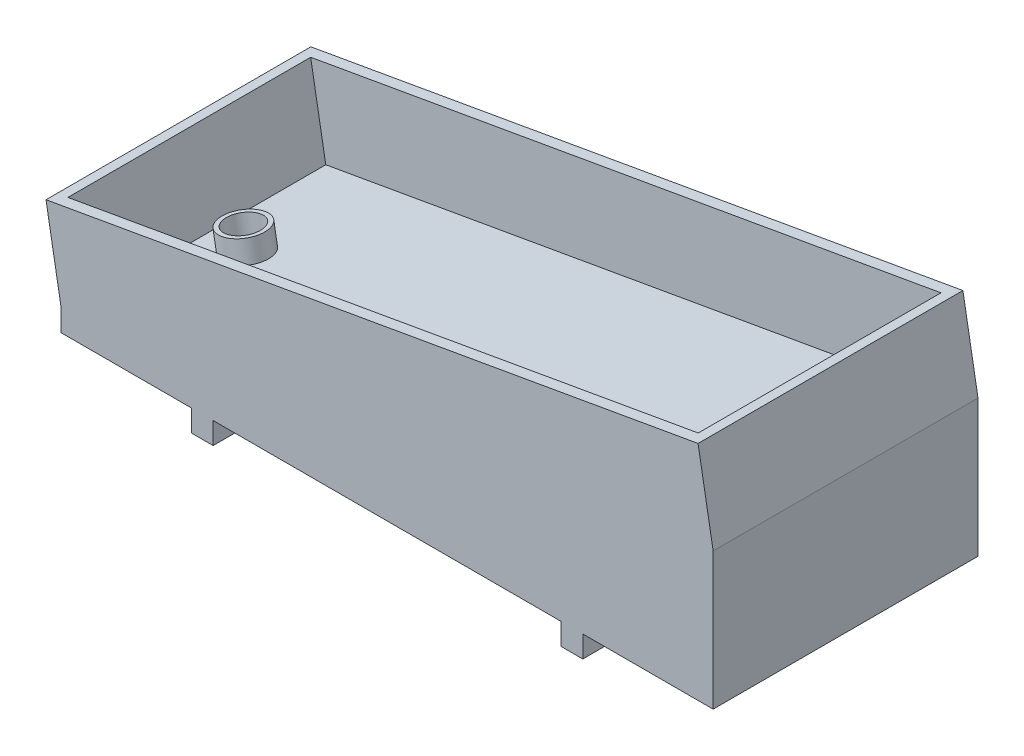
ISO-10303-21;
HEADER;
FILE_DESCRIPTION(('STEP AP214'),'2;1');
FILE_NAME('part.step','',(''),(''),'','','');
FILE_SCHEMA(('AUTOMOTIVE_DESIGN { 1 0 10303 214 1 1 1 1 }'));
ENDSEC;
DATA;
#1=APPLICATION_CONTEXT('core data for automotive mechanical design processes');
#2=APPLICATION_PROTOCOL_DEFINITION('international standard','automotive_design',2000,#1);
#3=PRODUCT_CONTEXT('',#1,'mechanical');
#4=PRODUCT('Part','Part','',(#3));
#5=PRODUCT_RELATED_PRODUCT_CATEGORY('part','',(#4));
#6=PRODUCT_DEFINITION_FORMATION('','',#4);
#7=PRODUCT_DEFINITION_CONTEXT('part definition',#1,'design');
#8=PRODUCT_DEFINITION('design','',#6,#7);
#9=PRODUCT_DEFINITION_SHAPE('','',#8);
#10=(LENGTH_UNIT() NAMED_UNIT(*) SI_UNIT(.MILLI.,.METRE.));
#11=(NAMED_UNIT(*) PLANE_ANGLE_UNIT() SI_UNIT($,.RADIAN.));
#12=(NAMED_UNIT(*) SI_UNIT($,.STERADIAN.) SOLID_ANGLE_UNIT());
#13=UNCERTAINTY_MEASURE_WITH_UNIT(LENGTH_MEASURE(1.E-05),#10,'distance_accuracy_value','');
#14=(GEOMETRIC_REPRESENTATION_CONTEXT(3) GLOBAL_UNCERTAINTY_ASSIGNED_CONTEXT((#13)) GLOBAL_UNIT_ASSIGNED_CONTEXT((#10,
#11,#12)) REPRESENTATION_CONTEXT('',''));
#15=CARTESIAN_POINT('',(0.,0.,0.));
#16=DIRECTION('',(0.,0.,1.));
#17=DIRECTION('',(1.,0.,0.));
#18=AXIS2_PLACEMENT_3D('',#15,#16,#17);
#19=CARTESIAN_POINT('',(0.,-50.8,609.6));
#20=DIRECTION('',(0.,1.,0.));
#21=DIRECTION('',(0.,0.,1.));
#22=AXIS2_PLACEMENT_3D('',#19,#20,#21);
#23=PLANE('',#22);
#24=DIRECTION('',(0.,0.,1.));
#25=VECTOR('',#24,1.);
#26=CARTESIAN_POINT('',(1200.8470155906,-50.8,-8.74808402730376E-13));
#27=LINE('',#26,#25);
#28=CARTESIAN_POINT('',(1200.8470155906,-50.8,0.));
#29=VERTEX_POINT('',#28);
#30=CARTESIAN_POINT('',(1200.8470155906,-50.8,609.6));
#31=VERTEX_POINT('',#30);
#32=EDGE_CURVE('E340',#29,#31,#27,.T.);
#33=ORIENTED_EDGE('',*,*,#32,.F.);
#34=DIRECTION('',(1.,0.,0.));
#35=VECTOR('',#34,1.);
#36=CARTESIAN_POINT('',(0.,-50.8,0.));
#37=LINE('',#36,#35);
#38=CARTESIAN_POINT('',(1500.8470155906,-50.8,0.));
#39=VERTEX_POINT('',#38);
#40=EDGE_CURVE('E192',#29,#39,#37,.T.);
#41=ORIENTED_EDGE('',*,*,#40,.T.);
#42=DIRECTION('',(0.,0.,-1.));
#43=VECTOR('',#42,1.);
#44=CARTESIAN_POINT('',(1500.8470155906,-50.8,609.6));
#45=LINE('',#44,#43);
#46=CARTESIAN_POINT('',(1500.8470155906,-50.8,609.6));
#47=VERTEX_POINT('',#46);
#48=EDGE_CURVE('E302',#47,#39,#45,.T.);
#49=ORIENTED_EDGE('',*,*,#48,.F.);
#50=DIRECTION('',(1.,0.,0.));
#51=VECTOR('',#50,1.);
#52=CARTESIAN_POINT('',(0.,-50.8,609.6));
#53=LINE('',#52,#51);
#54=EDGE_CURVE('E57',#31,#47,#53,.T.);
#55=ORIENTED_EDGE('',*,*,#54,.F.);
#56=EDGE_LOOP('',(#33,#41,#49,#55));
#57=FACE_BOUND('',#56,.T.);
#58=ADVANCED_FACE('F42',(#57),#23,.F.);
#59=DIRECTION('',(0.,0.,-1.));
#60=VECTOR('',#59,1.);
#61=CARTESIAN_POINT('',(1150.8470155906,-50.8,-4.19191881407426E-13));
#62=LINE('',#61,#60);
#63=CARTESIAN_POINT('',(1150.8470155906,-50.8,609.6));
#64=VERTEX_POINT('',#63);
#65=CARTESIAN_POINT('',(1150.8470155906,-50.8,0.));
#66=VERTEX_POINT('',#65);
#67=EDGE_CURVE('E65',#64,#66,#62,.T.);
#68=ORIENTED_EDGE('',*,*,#67,.F.);
#69=CARTESIAN_POINT('',(350.,-50.8,609.6));
#70=VERTEX_POINT('',#69);
#71=EDGE_CURVE('E289',#70,#64,#53,.T.);
#72=ORIENTED_EDGE('',*,*,#71,.F.);
#73=DIRECTION('',(0.,0.,-1.));
#74=VECTOR('',#73,1.);
#75=CARTESIAN_POINT('',(350.,-50.8,0.));
#76=LINE('',#75,#74);
#77=CARTESIAN_POINT('',(350.,-50.8,0.));
#78=VERTEX_POINT('',#77);
#79=EDGE_CURVE('E196',#70,#78,#76,.T.);
#80=ORIENTED_EDGE('',*,*,#79,.T.);
#81=EDGE_CURVE('E297',#78,#66,#37,.T.);
#82=ORIENTED_EDGE('',*,*,#81,.T.);
#83=EDGE_LOOP('',(#68,#72,#80,#82));
#84=FACE_BOUND('',#83,.T.);
#85=ADVANCED_FACE('F342',(#84),#23,.F.);
#86=CARTESIAN_POINT('',(136.291907750462,-50.8,304.8));
#87=DIRECTION('',(0.,1.,0.));
#88=DIRECTION('',(-1.,0.,0.));
#89=AXIS2_PLACEMENT_3D('',#86,#87,#88);
#90=ELLIPSE('',#89,40.6170644754298,40.);
#91=CARTESIAN_POINT('',(95.6748432750326,-50.8,304.8));
#92=VERTEX_POINT('',#91);
#93=EDGE_CURVE('E225',#92,#92,#90,.T.);
#94=ORIENTED_EDGE('',*,*,#93,.T.);
#95=EDGE_LOOP('',(#94));
#96=FACE_BOUND('',#95,.T.);
#97=CARTESIAN_POINT('',(0.,-50.8,0.));
#98=VERTEX_POINT('',#97);
#99=CARTESIAN_POINT('',(300.,-50.8,0.));
#100=VERTEX_POINT('',#99);
#101=EDGE_CURVE('E294',#98,#100,#37,.T.);
#102=ORIENTED_EDGE('',*,*,#101,.T.);
#103=DIRECTION('',(0.,0.,1.));
#104=VECTOR('',#103,1.);
#105=CARTESIAN_POINT('',(300.,-50.8,0.));
#106=LINE('',#105,#104);
#107=CARTESIAN_POINT('',(300.,-50.8,609.6));
#108=VERTEX_POINT('',#107);
#109=EDGE_CURVE('E193',#100,#108,#106,.T.);
#110=ORIENTED_EDGE('',*,*,#109,.T.);
#111=CARTESIAN_POINT('',(0.,-50.8,609.6));
#112=VERTEX_POINT('',#111);
#113=EDGE_CURVE('E285',#112,#108,#53,.T.);
#114=ORIENTED_EDGE('',*,*,#113,.F.);
#115=DIRECTION('',(0.,0.,-1.));
#116=VECTOR('',#115,1.);
#117=CARTESIAN_POINT('',(0.,-50.8,609.6));
#118=LINE('',#117,#116);
#119=EDGE_CURVE('E50',#112,#98,#118,.T.);
#120=ORIENTED_EDGE('',*,*,#119,.T.);
#121=EDGE_LOOP('',(#102,#110,#114,#120));
#122=FACE_BOUND('',#121,.T.);
#123=ADVANCED_FACE('F309',(#96,#122),#23,.F.);
#124=CARTESIAN_POINT('',(0.,0.,609.6));
#125=DIRECTION('',(1.,0.,0.));
#126=DIRECTION('',(0.,1.,0.));
#127=AXIS2_PLACEMENT_3D('',#124,#125,#126);
#128=PLANE('',#127);
#129=DIRECTION('',(0.,-1.,0.));
#130=VECTOR('',#129,1.);
#131=CARTESIAN_POINT('',(0.,0.,0.));
#132=LINE('',#131,#130);
#133=CARTESIAN_POINT('',(0.,0.,2.22044604925031E-13));
#134=VERTEX_POINT('',#133);
#135=EDGE_CURVE('E273',#134,#98,#132,.T.);
#136=ORIENTED_EDGE('',*,*,#135,.T.);
#137=ORIENTED_EDGE('',*,*,#119,.F.);
#138=DIRECTION('',(0.,-1.,0.));
#139=VECTOR('',#138,1.);
#140=CARTESIAN_POINT('',(0.,0.,609.6));
#141=LINE('',#140,#139);
#142=CARTESIAN_POINT('',(0.,0.,609.6));
#143=VERTEX_POINT('',#142);
#144=EDGE_CURVE('E282',#143,#112,#141,.T.);
#145=ORIENTED_EDGE('',*,*,#144,.F.);
#146=DIRECTION('',(0.,0.,-1.));
#147=VECTOR('',#146,1.);
#148=CARTESIAN_POINT('',(0.,0.,609.6));
#149=LINE('',#148,#147);
#150=EDGE_CURVE('E11',#143,#134,#149,.T.);
#151=ORIENTED_EDGE('',*,*,#150,.T.);
#152=EDGE_LOOP('',(#136,#137,#145,#151));
#153=FACE_BOUND('',#152,.T.);
#154=ADVANCED_FACE('F325',(#153),#128,.F.);
#155=CARTESIAN_POINT('',(1500.8470155906,0.,609.6));
#156=DIRECTION('',(-1.,0.,0.));
#157=DIRECTION('',(0.,0.,1.));
#158=AXIS2_PLACEMENT_3D('',#155,#156,#157);
#159=PLANE('',#158);
#160=DIRECTION('',(0.,1.,0.));
#161=VECTOR('',#160,1.);
#162=CARTESIAN_POINT('',(1500.8470155906,0.,0.));
#163=LINE('',#162,#161);
#164=CARTESIAN_POINT('',(1500.8470155906,264.639822764403,0.));
#165=VERTEX_POINT('',#164);
#166=EDGE_CURVE('E284',#39,#165,#163,.T.);
#167=ORIENTED_EDGE('',*,*,#166,.T.);
#168=DIRECTION('',(0.,0.,-1.));
#169=VECTOR('',#168,1.);
#170=CARTESIAN_POINT('',(1500.8470155906,264.639822764403,609.6));
#171=LINE('',#170,#169);
#172=CARTESIAN_POINT('',(1500.8470155906,264.639822764403,609.6));
#173=VERTEX_POINT('',#172);
#174=EDGE_CURVE('E292',#173,#165,#171,.T.);
#175=ORIENTED_EDGE('',*,*,#174,.F.);
#176=DIRECTION('',(0.,1.,0.));
#177=VECTOR('',#176,1.);
#178=CARTESIAN_POINT('',(1500.8470155906,0.,609.6));
#179=LINE('',#178,#177);
#180=EDGE_CURVE('E288',#47,#173,#179,.T.);
#181=ORIENTED_EDGE('',*,*,#180,.F.);
#182=ORIENTED_EDGE('',*,*,#48,.T.);
#183=EDGE_LOOP('',(#167,#175,#181,#182));
#184=FACE_BOUND('',#183,.T.);
#185=ADVANCED_FACE('F339',(#184),#159,.F.);
#186=CARTESIAN_POINT('',(0.,0.,609.6));
#187=DIRECTION('',(0.,0.,1.));
#188=DIRECTION('',(1.,0.,0.));
#189=AXIS2_PLACEMENT_3D('',#186,#187,#188);
#190=PLANE('',#189);
#191=ORIENTED_EDGE('',*,*,#180,.T.);
#192=DIRECTION('',(0.173648177666931,-0.984807753012208,0.));
#193=VECTOR('',#192,1.);
#194=CARTESIAN_POINT('',(1466.11738005722,461.601373366845,609.6));
#195=LINE('',#194,#193);
#196=CARTESIAN_POINT('',(1466.11738005722,461.601373366845,609.6));
#197=VERTEX_POINT('',#196);
#198=EDGE_CURVE('E265',#197,#173,#195,.T.);
#199=ORIENTED_EDGE('',*,*,#198,.F.);
#200=DIRECTION('',(0.984807753012208,0.173648177666931,0.));
#201=VECTOR('',#200,1.);
#202=CARTESIAN_POINT('',(-34.7296355333863,196.961550602442,609.6));
#203=LINE('',#202,#201);
#204=CARTESIAN_POINT('',(-34.7296355333863,196.961550602441,609.6));
#205=VERTEX_POINT('',#204);
#206=EDGE_CURVE('E250',#205,#197,#203,.T.);
#207=ORIENTED_EDGE('',*,*,#206,.F.);
#208=DIRECTION('',(0.173648177666931,-0.984807753012208,0.));
#209=VECTOR('',#208,1.);
#210=CARTESIAN_POINT('',(-34.7296355333863,196.961550602441,609.6));
#211=LINE('',#210,#209);
#212=EDGE_CURVE('E268',#205,#143,#211,.T.);
#213=ORIENTED_EDGE('',*,*,#212,.T.);
#214=ORIENTED_EDGE('',*,*,#144,.T.);
#215=ORIENTED_EDGE('',*,*,#113,.T.);
#216=DIRECTION('',(0.,1.,0.));
#217=VECTOR('',#216,1.);
#218=CARTESIAN_POINT('',(300.,-100.8,609.6));
#219=LINE('',#218,#217);
#220=CARTESIAN_POINT('',(300.,-100.8,609.6));
#221=VERTEX_POINT('',#220);
#222=EDGE_CURVE('E211',#221,#108,#219,.T.);
#223=ORIENTED_EDGE('',*,*,#222,.F.);
#224=DIRECTION('',(-1.,0.,0.));
#225=VECTOR('',#224,1.);
#226=CARTESIAN_POINT('',(0.,-100.8,609.6));
#227=LINE('',#226,#225);
#228=CARTESIAN_POINT('',(350.,-100.8,609.6));
#229=VERTEX_POINT('',#228);
#230=EDGE_CURVE('E210',#229,#221,#227,.T.);
#231=ORIENTED_EDGE('',*,*,#230,.F.);
#232=DIRECTION('',(0.,1.,0.));
#233=VECTOR('',#232,1.);
#234=CARTESIAN_POINT('',(350.,-100.8,609.6));
#235=LINE('',#234,#233);
#236=EDGE_CURVE('E216',#229,#70,#235,.T.);
#237=ORIENTED_EDGE('',*,*,#236,.T.);
#238=ORIENTED_EDGE('',*,*,#71,.T.);
#239=DIRECTION('',(0.,1.,0.));
#240=VECTOR('',#239,1.);
#241=CARTESIAN_POINT('',(1150.8470155906,-100.8,609.6));
#242=LINE('',#241,#240);
#243=CARTESIAN_POINT('',(1150.8470155906,-100.8,609.6));
#244=VERTEX_POINT('',#243);
#245=EDGE_CURVE('E198',#244,#64,#242,.T.);
#246=ORIENTED_EDGE('',*,*,#245,.F.);
#247=DIRECTION('',(-1.,0.,0.));
#248=VECTOR('',#247,1.);
#249=CARTESIAN_POINT('',(0.,-100.8,609.6));
#250=LINE('',#249,#248);
#251=CARTESIAN_POINT('',(1200.8470155906,-100.8,609.6));
#252=VERTEX_POINT('',#251);
#253=EDGE_CURVE('E178',#252,#244,#250,.T.);
#254=ORIENTED_EDGE('',*,*,#253,.F.);
#255=DIRECTION('',(0.,1.,0.));
#256=VECTOR('',#255,1.);
#257=CARTESIAN_POINT('',(1200.8470155906,-100.8,609.6));
#258=LINE('',#257,#256);
#259=EDGE_CURVE('E175',#252,#31,#258,.T.);
#260=ORIENTED_EDGE('',*,*,#259,.T.);
#261=ORIENTED_EDGE('',*,*,#54,.T.);
#262=EDGE_LOOP('',(#191,#199,#207,#213,#214,#215,#223,#231,#237,#238,#246,#254,#260,#261));
#263=FACE_BOUND('',#262,.T.);
#264=ADVANCED_FACE('F321',(#263),#190,.T.);
#265=CARTESIAN_POINT('',(0.,0.,0.));
#266=DIRECTION('',(0.,0.,1.));
#267=DIRECTION('',(1.,0.,0.));
#268=AXIS2_PLACEMENT_3D('',#265,#266,#267);
#269=PLANE('',#268);
#270=ORIENTED_EDGE('',*,*,#135,.F.);
#271=DIRECTION('',(0.173648177666931,-0.984807753012208,0.));
#272=VECTOR('',#271,1.);
#273=CARTESIAN_POINT('',(-34.7296355333863,196.961550602442,2.22044604925031E-13));
#274=LINE('',#273,#272);
#275=CARTESIAN_POINT('',(-34.7296355333863,196.961550602442,2.22044604925031E-13));
#276=VERTEX_POINT('',#275);
#277=EDGE_CURVE('E271',#276,#134,#274,.T.);
#278=ORIENTED_EDGE('',*,*,#277,.F.);
#279=DIRECTION('',(-0.984807753012208,-0.173648177666931,0.));
#280=VECTOR('',#279,1.);
#281=CARTESIAN_POINT('',(-34.7296355333863,196.961550602442,0.));
#282=LINE('',#281,#280);
#283=CARTESIAN_POINT('',(1466.11738005722,461.601373366845,2.22044604925031E-13));
#284=VERTEX_POINT('',#283);
#285=EDGE_CURVE('E245',#284,#276,#282,.T.);
#286=ORIENTED_EDGE('',*,*,#285,.F.);
#287=DIRECTION('',(0.173648177666931,-0.984807753012208,0.));
#288=VECTOR('',#287,1.);
#289=CARTESIAN_POINT('',(1466.11738005722,461.601373366845,2.22044604925031E-13));
#290=LINE('',#289,#288);
#291=EDGE_CURVE('E263',#284,#165,#290,.T.);
#292=ORIENTED_EDGE('',*,*,#291,.T.);
#293=ORIENTED_EDGE('',*,*,#166,.F.);
#294=ORIENTED_EDGE('',*,*,#40,.F.);
#295=DIRECTION('',(0.,1.,0.));
#296=VECTOR('',#295,1.);
#297=CARTESIAN_POINT('',(1200.8470155906,-100.8,0.));
#298=LINE('',#297,#296);
#299=CARTESIAN_POINT('',(1200.8470155906,-100.8,0.));
#300=VERTEX_POINT('',#299);
#301=EDGE_CURVE('E173',#300,#29,#298,.T.);
#302=ORIENTED_EDGE('',*,*,#301,.F.);
#303=DIRECTION('',(1.,0.,0.));
#304=VECTOR('',#303,1.);
#305=CARTESIAN_POINT('',(0.,-100.8,0.));
#306=LINE('',#305,#304);
#307=CARTESIAN_POINT('',(1150.8470155906,-100.8,0.));
#308=VERTEX_POINT('',#307);
#309=EDGE_CURVE('E179',#308,#300,#306,.T.);
#310=ORIENTED_EDGE('',*,*,#309,.F.);
#311=DIRECTION('',(0.,1.,0.));
#312=VECTOR('',#311,1.);
#313=CARTESIAN_POINT('',(1150.8470155906,-100.8,0.));
#314=LINE('',#313,#312);
#315=EDGE_CURVE('E347',#308,#66,#314,.T.);
#316=ORIENTED_EDGE('',*,*,#315,.T.);
#317=ORIENTED_EDGE('',*,*,#81,.F.);
#318=DIRECTION('',(0.,1.,0.));
#319=VECTOR('',#318,1.);
#320=CARTESIAN_POINT('',(350.,-100.8,0.));
#321=LINE('',#320,#319);
#322=CARTESIAN_POINT('',(350.,-100.8,0.));
#323=VERTEX_POINT('',#322);
#324=EDGE_CURVE('E218',#323,#78,#321,.T.);
#325=ORIENTED_EDGE('',*,*,#324,.F.);
#326=DIRECTION('',(1.,0.,0.));
#327=VECTOR('',#326,1.);
#328=CARTESIAN_POINT('',(0.,-100.8,0.));
#329=LINE('',#328,#327);
#330=CARTESIAN_POINT('',(300.,-100.8,0.));
#331=VERTEX_POINT('',#330);
#332=EDGE_CURVE('E205',#331,#323,#329,.T.);
#333=ORIENTED_EDGE('',*,*,#332,.F.);
#334=DIRECTION('',(0.,1.,0.));
#335=VECTOR('',#334,1.);
#336=CARTESIAN_POINT('',(300.,-100.8,0.));
#337=LINE('',#336,#335);
#338=EDGE_CURVE('E220',#331,#100,#337,.T.);
#339=ORIENTED_EDGE('',*,*,#338,.T.);
#340=ORIENTED_EDGE('',*,*,#101,.F.);
#341=EDGE_LOOP('',(#270,#278,#286,#292,#293,#294,#302,#310,#316,#317,#325,#333,#339,#340));
#342=FACE_BOUND('',#341,.T.);
#343=ADVANCED_FACE('F190',(#342),#269,.F.);
#344=CARTESIAN_POINT('',(-34.7296355333863,196.961550602442,0.));
#345=DIRECTION('',(0.984807753012208,0.173648177666931,0.));
#346=DIRECTION('',(-0.173648177666931,0.984807753012208,0.));
#347=AXIS2_PLACEMENT_3D('',#344,#345,#346);
#348=PLANE('',#347);
#349=ORIENTED_EDGE('',*,*,#150,.F.);
#350=ORIENTED_EDGE('',*,*,#212,.F.);
#351=DIRECTION('',(0.,0.,1.));
#352=VECTOR('',#351,1.);
#353=CARTESIAN_POINT('',(-34.7296355333863,196.961550602442,0.));
#354=LINE('',#353,#352);
#355=EDGE_CURVE('E248',#276,#205,#354,.T.);
#356=ORIENTED_EDGE('',*,*,#355,.F.);
#357=ORIENTED_EDGE('',*,*,#277,.T.);
#358=EDGE_LOOP('',(#349,#350,#356,#357));
#359=FACE_BOUND('',#358,.T.);
#360=ADVANCED_FACE('F327',(#359),#348,.F.);
#361=CARTESIAN_POINT('',(-9.71551860687631,201.372214315182,0.));
#362=DIRECTION('',(-0.984807753012208,-0.173648177666931,0.));
#363=DIRECTION('',(0.173648177666931,-0.984807753012208,0.));
#364=AXIS2_PLACEMENT_3D('',#361,#362,#363);
#365=PLANE('',#364);
#366=DIRECTION('',(0.,0.,-1.));
#367=VECTOR('',#366,1.);
#368=CARTESIAN_POINT('',(25.01411692651,4.41066371274003,0.));
#369=LINE('',#368,#367);
#370=CARTESIAN_POINT('',(25.01411692651,4.41066371273998,584.2));
#371=VERTEX_POINT('',#370);
#372=CARTESIAN_POINT('',(25.01411692651,4.41066371274003,25.4));
#373=VERTEX_POINT('',#372);
#374=EDGE_CURVE('E232',#371,#373,#369,.T.);
#375=ORIENTED_EDGE('',*,*,#374,.T.);
#376=DIRECTION('',(0.173648177666931,-0.984807753012208,0.));
#377=VECTOR('',#376,1.);
#378=CARTESIAN_POINT('',(-9.71551860687629,201.372214315182,25.4));
#379=LINE('',#378,#377);
#380=CARTESIAN_POINT('',(-9.71551860687629,201.372214315182,25.4));
#381=VERTEX_POINT('',#380);
#382=EDGE_CURVE('E266',#381,#373,#379,.T.);
#383=ORIENTED_EDGE('',*,*,#382,.F.);
#384=DIRECTION('',(0.,0.,-1.));
#385=VECTOR('',#384,1.);
#386=CARTESIAN_POINT('',(-9.71551860687631,201.372214315182,0.));
#387=LINE('',#386,#385);
#388=CARTESIAN_POINT('',(-9.71551860687631,201.372214315182,584.2));
#389=VERTEX_POINT('',#388);
#390=EDGE_CURVE('E235',#389,#381,#387,.T.);
#391=ORIENTED_EDGE('',*,*,#390,.F.);
#392=DIRECTION('',(0.173648177666931,-0.984807753012208,0.));
#393=VECTOR('',#392,1.);
#394=CARTESIAN_POINT('',(-9.71551860687631,201.372214315182,584.2));
#395=LINE('',#394,#393);
#396=EDGE_CURVE('E254',#389,#371,#395,.T.);
#397=ORIENTED_EDGE('',*,*,#396,.T.);
#398=EDGE_LOOP('',(#375,#383,#391,#397));
#399=FACE_BOUND('',#398,.T.);
#400=ADVANCED_FACE('F405',(#399),#365,.F.);
#401=CARTESIAN_POINT('',(-34.7296355333863,196.961550602442,25.4));
#402=DIRECTION('',(0.,0.,-1.));
#403=DIRECTION('',(-1.,0.,0.));
#404=AXIS2_PLACEMENT_3D('',#401,#402,#403);
#405=PLANE('',#404);
#406=DIRECTION('',(0.984807753012208,0.173648177666931,0.));
#407=VECTOR('',#406,1.);
#408=CARTESIAN_POINT('',(0.,0.,25.4));
#409=LINE('',#408,#407);
#410=CARTESIAN_POINT('',(1475.8328986641,260.229159051663,25.4));
#411=VERTEX_POINT('',#410);
#412=EDGE_CURVE('E257',#373,#411,#409,.T.);
#413=ORIENTED_EDGE('',*,*,#412,.T.);
#414=DIRECTION('',(0.173648177666931,-0.984807753012208,0.));
#415=VECTOR('',#414,1.);
#416=CARTESIAN_POINT('',(1441.10326313071,457.190709654105,25.4));
#417=LINE('',#416,#415);
#418=CARTESIAN_POINT('',(1441.10326313071,457.190709654105,25.4));
#419=VERTEX_POINT('',#418);
#420=EDGE_CURVE('E278',#419,#411,#417,.T.);
#421=ORIENTED_EDGE('',*,*,#420,.F.);
#422=DIRECTION('',(0.984807753012208,0.173648177666931,0.));
#423=VECTOR('',#422,1.);
#424=CARTESIAN_POINT('',(-34.7296355333863,196.961550602442,25.4));
#425=LINE('',#424,#423);
#426=EDGE_CURVE('E238',#381,#419,#425,.T.);
#427=ORIENTED_EDGE('',*,*,#426,.F.);
#428=ORIENTED_EDGE('',*,*,#382,.T.);
#429=EDGE_LOOP('',(#413,#421,#427,#428));
#430=FACE_BOUND('',#429,.T.);
#431=ADVANCED_FACE('F412',(#430),#405,.F.);
#432=CARTESIAN_POINT('',(1441.10326313071,457.190709654105,0.));
#433=DIRECTION('',(0.984807753012208,0.173648177666931,0.));
#434=DIRECTION('',(-0.173648177666931,0.984807753012208,0.));
#435=AXIS2_PLACEMENT_3D('',#432,#433,#434);
#436=PLANE('',#435);
#437=DIRECTION('',(0.,0.,1.));
#438=VECTOR('',#437,1.);
#439=CARTESIAN_POINT('',(1475.83289866409,260.229159051663,0.));
#440=LINE('',#439,#438);
#441=CARTESIAN_POINT('',(1475.83289866409,260.229159051663,584.2));
#442=VERTEX_POINT('',#441);
#443=EDGE_CURVE('E259',#411,#442,#440,.T.);
#444=ORIENTED_EDGE('',*,*,#443,.T.);
#445=DIRECTION('',(0.173648177666931,-0.984807753012208,0.));
#446=VECTOR('',#445,1.);
#447=CARTESIAN_POINT('',(1441.10326313071,457.190709654105,584.2));
#448=LINE('',#447,#446);
#449=CARTESIAN_POINT('',(1441.10326313071,457.190709654105,584.2));
#450=VERTEX_POINT('',#449);
#451=EDGE_CURVE('E276',#450,#442,#448,.T.);
#452=ORIENTED_EDGE('',*,*,#451,.F.);
#453=DIRECTION('',(0.,0.,1.));
#454=VECTOR('',#453,1.);
#455=CARTESIAN_POINT('',(1441.10326313071,457.190709654105,0.));
#456=LINE('',#455,#454);
#457=EDGE_CURVE('E241',#419,#450,#456,.T.);
#458=ORIENTED_EDGE('',*,*,#457,.F.);
#459=ORIENTED_EDGE('',*,*,#420,.T.);
#460=EDGE_LOOP('',(#444,#452,#458,#459));
#461=FACE_BOUND('',#460,.T.);
#462=ADVANCED_FACE('F408',(#461),#436,.F.);
#463=CARTESIAN_POINT('',(-34.7296355333862,196.961550602442,584.2));
#464=DIRECTION('',(0.,0.,1.));
#465=DIRECTION('',(1.,0.,0.));
#466=AXIS2_PLACEMENT_3D('',#463,#464,#465);
#467=PLANE('',#466);
#468=DIRECTION('',(-0.984807753012208,-0.173648177666931,0.));
#469=VECTOR('',#468,1.);
#470=CARTESIAN_POINT('',(0.,0.,584.2));
#471=LINE('',#470,#469);
#472=EDGE_CURVE('E239',#442,#371,#471,.T.);
#473=ORIENTED_EDGE('',*,*,#472,.T.);
#474=ORIENTED_EDGE('',*,*,#396,.F.);
#475=DIRECTION('',(-0.984807753012208,-0.173648177666931,0.));
#476=VECTOR('',#475,1.);
#477=CARTESIAN_POINT('',(-34.7296355333862,196.961550602442,584.2));
#478=LINE('',#477,#476);
#479=EDGE_CURVE('E243',#450,#389,#478,.T.);
#480=ORIENTED_EDGE('',*,*,#479,.F.);
#481=ORIENTED_EDGE('',*,*,#451,.T.);
#482=EDGE_LOOP('',(#473,#474,#480,#481));
#483=FACE_BOUND('',#482,.T.);
#484=ADVANCED_FACE('F402',(#483),#467,.F.);
#485=CARTESIAN_POINT('',(1466.11738005722,461.601373366845,0.));
#486=DIRECTION('',(-0.984807753012208,-0.173648177666931,0.));
#487=DIRECTION('',(0.173648177666931,-0.984807753012208,0.));
#488=AXIS2_PLACEMENT_3D('',#485,#486,#487);
#489=PLANE('',#488);
#490=ORIENTED_EDGE('',*,*,#174,.T.);
#491=ORIENTED_EDGE('',*,*,#291,.F.);
#492=DIRECTION('',(0.,0.,-1.));
#493=VECTOR('',#492,1.);
#494=CARTESIAN_POINT('',(1466.11738005722,461.601373366845,0.));
#495=LINE('',#494,#493);
#496=EDGE_CURVE('E252',#197,#284,#495,.T.);
#497=ORIENTED_EDGE('',*,*,#496,.F.);
#498=ORIENTED_EDGE('',*,*,#198,.T.);
#499=EDGE_LOOP('',(#490,#491,#497,#498));
#500=FACE_BOUND('',#499,.T.);
#501=ADVANCED_FACE('F335',(#500),#489,.F.);
#502=CARTESIAN_POINT('',(-34.7296355333863,196.961550602442,0.));
#503=DIRECTION('',(-0.173648177666931,0.984807753012208,0.));
#504=DIRECTION('',(-0.984807753012208,-0.173648177666931,0.));
#505=AXIS2_PLACEMENT_3D('',#502,#503,#504);
#506=PLANE('',#505);
#507=ORIENTED_EDGE('',*,*,#390,.T.);
#508=ORIENTED_EDGE('',*,*,#426,.T.);
#509=ORIENTED_EDGE('',*,*,#457,.T.);
#510=ORIENTED_EDGE('',*,*,#479,.T.);
#511=EDGE_LOOP('',(#507,#508,#509,#510));
#512=FACE_BOUND('',#511,.T.);
#513=ORIENTED_EDGE('',*,*,#285,.T.);
#514=ORIENTED_EDGE('',*,*,#355,.T.);
#515=ORIENTED_EDGE('',*,*,#206,.T.);
#516=ORIENTED_EDGE('',*,*,#496,.T.);
#517=EDGE_LOOP('',(#513,#514,#515,#516));
#518=FACE_BOUND('',#517,.T.);
#519=ADVANCED_FACE('F331',(#512,#518),#506,.T.);
#520=CARTESIAN_POINT('',(0.,0.,609.6));
#521=DIRECTION('',(-0.173648177666931,0.984807753012208,0.));
#522=DIRECTION('',(-0.984807753012208,-0.173648177666931,0.));
#523=AXIS2_PLACEMENT_3D('',#520,#521,#522);
#524=PLANE('',#523);
#525=CARTESIAN_POINT('',(123.494892227731,21.7754814794331,304.8));
#526=DIRECTION('',(-0.173648177666931,0.984807753012208,0.));
#527=DIRECTION('',(-0.984807753012208,-0.173648177666931,0.));
#528=AXIS2_PLACEMENT_3D('',#525,#526,#527);
#529=CIRCLE('',#528,50.);
#530=CARTESIAN_POINT('',(74.2545045771203,13.0930725960865,304.8));
#531=VERTEX_POINT('',#530);
#532=EDGE_CURVE('E228',#531,#531,#529,.T.);
#533=ORIENTED_EDGE('',*,*,#532,.F.);
#534=EDGE_LOOP('',(#533));
#535=FACE_BOUND('',#534,.T.);
#536=ORIENTED_EDGE('',*,*,#412,.F.);
#537=ORIENTED_EDGE('',*,*,#374,.F.);
#538=ORIENTED_EDGE('',*,*,#472,.F.);
#539=ORIENTED_EDGE('',*,*,#443,.F.);
#540=EDGE_LOOP('',(#536,#537,#538,#539));
#541=FACE_BOUND('',#540,.T.);
#542=ADVANCED_FACE('F44',(#535,#541),#524,.T.);
#543=CARTESIAN_POINT('',(114.812483344384,71.0158691300435,304.8));
#544=DIRECTION('',(0.173648177666931,-0.984807753012208,0.));
#545=DIRECTION('',(0.984807753012208,0.173648177666931,0.));
#546=AXIS2_PLACEMENT_3D('',#543,#544,#545);
#547=CYLINDRICAL_SURFACE('',#546,50.);
#548=CARTESIAN_POINT('',(114.812483344384,71.0158691300435,304.8));
#549=DIRECTION('',(-0.173648177666931,0.984807753012208,0.));
#550=DIRECTION('',(-0.984807753012208,-0.173648177666931,0.));
#551=AXIS2_PLACEMENT_3D('',#548,#549,#550);
#552=CIRCLE('',#551,50.);
#553=CARTESIAN_POINT('',(65.5720956937738,62.3334602466969,304.8));
#554=VERTEX_POINT('',#553);
#555=EDGE_CURVE('E229',#554,#554,#552,.T.);
#556=ORIENTED_EDGE('',*,*,#555,.F.);
#557=EDGE_LOOP('',(#556));
#558=FACE_BOUND('',#557,.T.);
#559=ORIENTED_EDGE('',*,*,#532,.T.);
#560=EDGE_LOOP('',(#559));
#561=FACE_BOUND('',#560,.T.);
#562=ADVANCED_FACE('F390',(#558,#561),#547,.T.);
#563=CARTESIAN_POINT('',(-8.68240888334656,49.2403876506104,0.));
#564=DIRECTION('',(-0.173648177666931,0.984807753012208,0.));
#565=DIRECTION('',(-0.984807753012208,-0.173648177666931,0.));
#566=AXIS2_PLACEMENT_3D('',#563,#564,#565);
#567=PLANE('',#566);
#568=CARTESIAN_POINT('',(114.812483344384,71.0158691300435,304.8));
#569=DIRECTION('',(-0.173648177666931,0.984807753012208,0.));
#570=DIRECTION('',(-0.984807753012208,-0.173648177666931,0.));
#571=AXIS2_PLACEMENT_3D('',#568,#569,#570);
#572=CIRCLE('',#571,40.);
#573=CARTESIAN_POINT('',(75.4201732238959,64.0699420233663,304.8));
#574=VERTEX_POINT('',#573);
#575=EDGE_CURVE('E222',#574,#574,#572,.T.);
#576=ORIENTED_EDGE('',*,*,#575,.F.);
#577=EDGE_LOOP('',(#576));
#578=FACE_BOUND('',#577,.T.);
#579=ORIENTED_EDGE('',*,*,#555,.T.);
#580=EDGE_LOOP('',(#579));
#581=FACE_BOUND('',#580,.T.);
#582=ADVANCED_FACE('F382',(#578,#581),#567,.T.);
#583=CARTESIAN_POINT('',(149.54211887777,-125.945681472398,304.8));
#584=DIRECTION('',(-0.173648177666931,0.984807753012208,0.));
#585=DIRECTION('',(-0.984807753012208,-0.173648177666931,0.));
#586=AXIS2_PLACEMENT_3D('',#583,#584,#585);
#587=CYLINDRICAL_SURFACE('',#586,40.);
#588=ORIENTED_EDGE('',*,*,#575,.T.);
#589=EDGE_LOOP('',(#588));
#590=FACE_BOUND('',#589,.T.);
#591=ORIENTED_EDGE('',*,*,#93,.F.);
#592=EDGE_LOOP('',(#591));
#593=FACE_BOUND('',#592,.T.);
#594=ADVANCED_FACE('F380',(#590,#593),#587,.F.);
#595=CARTESIAN_POINT('',(300.,-100.8,0.));
#596=DIRECTION('',(-1.,0.,0.));
#597=DIRECTION('',(0.,0.,1.));
#598=AXIS2_PLACEMENT_3D('',#595,#596,#597);
#599=PLANE('',#598);
#600=ORIENTED_EDGE('',*,*,#109,.F.);
#601=ORIENTED_EDGE('',*,*,#338,.F.);
#602=DIRECTION('',(0.,0.,1.));
#603=VECTOR('',#602,1.);
#604=CARTESIAN_POINT('',(300.,-100.8,0.));
#605=LINE('',#604,#603);
#606=EDGE_CURVE('E202',#331,#221,#605,.T.);
#607=ORIENTED_EDGE('',*,*,#606,.T.);
#608=ORIENTED_EDGE('',*,*,#222,.T.);
#609=EDGE_LOOP('',(#600,#601,#607,#608));
#610=FACE_BOUND('',#609,.T.);
#611=ADVANCED_FACE('F318',(#610),#599,.T.);
#612=CARTESIAN_POINT('',(350.,-100.8,0.));
#613=DIRECTION('',(1.,0.,0.));
#614=DIRECTION('',(0.,0.,-1.));
#615=AXIS2_PLACEMENT_3D('',#612,#613,#614);
#616=PLANE('',#615);
#617=ORIENTED_EDGE('',*,*,#79,.F.);
#618=ORIENTED_EDGE('',*,*,#236,.F.);
#619=DIRECTION('',(0.,0.,-1.));
#620=VECTOR('',#619,1.);
#621=CARTESIAN_POINT('',(350.,-100.8,0.));
#622=LINE('',#621,#620);
#623=EDGE_CURVE('E207',#229,#323,#622,.T.);
#624=ORIENTED_EDGE('',*,*,#623,.T.);
#625=ORIENTED_EDGE('',*,*,#324,.T.);
#626=EDGE_LOOP('',(#617,#618,#624,#625));
#627=FACE_BOUND('',#626,.T.);
#628=ADVANCED_FACE('F356',(#627),#616,.T.);
#629=CARTESIAN_POINT('',(0.,-100.8,0.));
#630=DIRECTION('',(0.,-1.,0.));
#631=DIRECTION('',(0.,0.,-1.));
#632=AXIS2_PLACEMENT_3D('',#629,#630,#631);
#633=PLANE('',#632);
#634=ORIENTED_EDGE('',*,*,#606,.F.);
#635=ORIENTED_EDGE('',*,*,#332,.T.);
#636=ORIENTED_EDGE('',*,*,#623,.F.);
#637=ORIENTED_EDGE('',*,*,#230,.T.);
#638=EDGE_LOOP('',(#634,#635,#636,#637));
#639=FACE_BOUND('',#638,.T.);
#640=ADVANCED_FACE('F358',(#639),#633,.T.);
#641=CARTESIAN_POINT('',(1200.8470155906,-100.8,-8.74808402730376E-13));
#642=DIRECTION('',(-1.,0.,0.));
#643=DIRECTION('',(0.,0.,1.));
#644=AXIS2_PLACEMENT_3D('',#641,#642,#643);
#645=PLANE('',#644);
#646=ORIENTED_EDGE('',*,*,#32,.T.);
#647=ORIENTED_EDGE('',*,*,#259,.F.);
#648=DIRECTION('',(0.,0.,1.));
#649=VECTOR('',#648,1.);
#650=CARTESIAN_POINT('',(1200.8470155906,-100.8,-8.74808402730376E-13));
#651=LINE('',#650,#649);
#652=EDGE_CURVE('E169',#300,#252,#651,.T.);
#653=ORIENTED_EDGE('',*,*,#652,.F.);
#654=ORIENTED_EDGE('',*,*,#301,.T.);
#655=EDGE_LOOP('',(#646,#647,#653,#654));
#656=FACE_BOUND('',#655,.T.);
#657=ADVANCED_FACE('F171',(#656),#645,.F.);
#658=CARTESIAN_POINT('',(1150.8470155906,-100.8,-4.19191881407426E-13));
#659=DIRECTION('',(1.,0.,0.));
#660=DIRECTION('',(0.,0.,-1.));
#661=AXIS2_PLACEMENT_3D('',#658,#659,#660);
#662=PLANE('',#661);
#663=ORIENTED_EDGE('',*,*,#67,.T.);
#664=ORIENTED_EDGE('',*,*,#315,.F.);
#665=DIRECTION('',(0.,0.,-1.));
#666=VECTOR('',#665,1.);
#667=CARTESIAN_POINT('',(1150.8470155906,-100.8,-4.19191881407426E-13));
#668=LINE('',#667,#666);
#669=EDGE_CURVE('E184',#244,#308,#668,.T.);
#670=ORIENTED_EDGE('',*,*,#669,.F.);
#671=ORIENTED_EDGE('',*,*,#245,.T.);
#672=EDGE_LOOP('',(#663,#664,#670,#671));
#673=FACE_BOUND('',#672,.T.);
#674=ADVANCED_FACE('F346',(#673),#662,.F.);
#675=CARTESIAN_POINT('',(0.,-100.8,0.));
#676=DIRECTION('',(0.,-1.,0.));
#677=DIRECTION('',(0.,0.,-1.));
#678=AXIS2_PLACEMENT_3D('',#675,#676,#677);
#679=PLANE('',#678);
#680=ORIENTED_EDGE('',*,*,#309,.T.);
#681=ORIENTED_EDGE('',*,*,#652,.T.);
#682=ORIENTED_EDGE('',*,*,#253,.T.);
#683=ORIENTED_EDGE('',*,*,#669,.T.);
#684=EDGE_LOOP('',(#680,#681,#682,#683));
#685=FACE_BOUND('',#684,.T.);
#686=ADVANCED_FACE('F182',(#685),#679,.T.);
#687=CLOSED_SHELL('',(#58,#85,#123,#154,#185,#264,#343,#360,#400,#431,#462,#484,#501,#519,#542,
#562,#582,#594,#611,#628,#640,#657,#674,#686));
#688=MANIFOLD_SOLID_BREP('B2',#687);
#689=ADVANCED_BREP_SHAPE_REPRESENTATION('',(#18,#688),#14);
#690=SHAPE_DEFINITION_REPRESENTATION(#9,#689);
ENDSEC;
END-ISO-10303-21;
